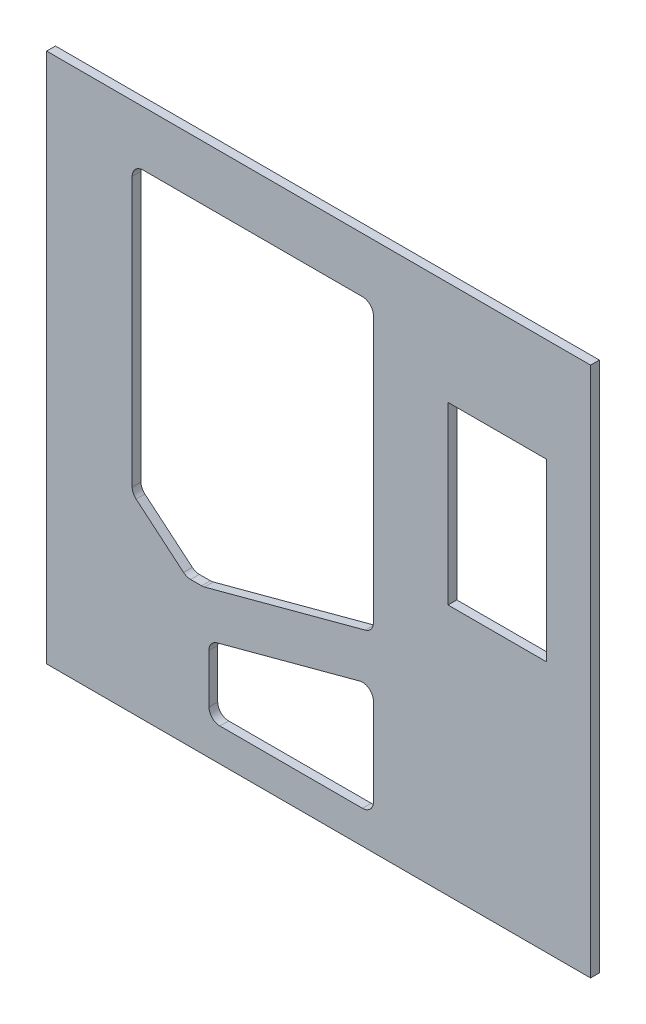
ISO-10303-21;
HEADER;
FILE_DESCRIPTION(('STEP AP214'),'2;1');
FILE_NAME('part.step','',(''),(''),'','','');
FILE_SCHEMA(('AUTOMOTIVE_DESIGN { 1 0 10303 214 1 1 1 1 }'));
ENDSEC;
DATA;
#1=APPLICATION_CONTEXT('core data for automotive mechanical design processes');
#2=APPLICATION_PROTOCOL_DEFINITION('international standard','automotive_design',2000,#1);
#3=PRODUCT_CONTEXT('',#1,'mechanical');
#4=PRODUCT('Part','Part','',(#3));
#5=PRODUCT_RELATED_PRODUCT_CATEGORY('part','',(#4));
#6=PRODUCT_DEFINITION_FORMATION('','',#4);
#7=PRODUCT_DEFINITION_CONTEXT('part definition',#1,'design');
#8=PRODUCT_DEFINITION('design','',#6,#7);
#9=PRODUCT_DEFINITION_SHAPE('','',#8);
#10=(LENGTH_UNIT() NAMED_UNIT(*) SI_UNIT(.MILLI.,.METRE.));
#11=(NAMED_UNIT(*) PLANE_ANGLE_UNIT() SI_UNIT($,.RADIAN.));
#12=(NAMED_UNIT(*) SI_UNIT($,.STERADIAN.) SOLID_ANGLE_UNIT());
#13=UNCERTAINTY_MEASURE_WITH_UNIT(LENGTH_MEASURE(1.E-05),#10,'distance_accuracy_value','');
#14=(GEOMETRIC_REPRESENTATION_CONTEXT(3) GLOBAL_UNCERTAINTY_ASSIGNED_CONTEXT((#13)) GLOBAL_UNIT_ASSIGNED_CONTEXT((#10,
#11,#12)) REPRESENTATION_CONTEXT('',''));
#15=CARTESIAN_POINT('',(0.,0.,0.));
#16=DIRECTION('',(0.,0.,1.));
#17=DIRECTION('',(1.,0.,0.));
#18=AXIS2_PLACEMENT_3D('',#15,#16,#17);
#19=CARTESIAN_POINT('',(0.,0.,8.));
#20=DIRECTION('',(0.,0.,-1.));
#21=DIRECTION('',(-1.,0.,0.));
#22=AXIS2_PLACEMENT_3D('',#19,#20,#21);
#23=PLANE('',#22);
#24=DIRECTION('',(0.,-1.,0.));
#25=VECTOR('',#24,1.);
#26=CARTESIAN_POINT('',(118.,147.567761437242,8.));
#27=LINE('',#26,#25);
#28=CARTESIAN_POINT('',(118.,147.567761437242,8.));
#29=VERTEX_POINT('',#28);
#30=CARTESIAN_POINT('',(118.,-12.4322385627576,8.));
#31=VERTEX_POINT('',#30);
#32=EDGE_CURVE('E246',#29,#31,#27,.T.);
#33=ORIENTED_EDGE('',*,*,#32,.F.);
#34=DIRECTION('',(-1.,0.,0.));
#35=VECTOR('',#34,1.);
#36=CARTESIAN_POINT('',(208.,147.567761437242,8.));
#37=LINE('',#36,#35);
#38=CARTESIAN_POINT('',(208.,147.567761437242,8.));
#39=VERTEX_POINT('',#38);
#40=EDGE_CURVE('E52',#39,#29,#37,.T.);
#41=ORIENTED_EDGE('',*,*,#40,.F.);
#42=DIRECTION('',(0.,1.,0.));
#43=VECTOR('',#42,1.);
#44=CARTESIAN_POINT('',(208.,-12.4322385627576,8.));
#45=LINE('',#44,#43);
#46=CARTESIAN_POINT('',(208.,-12.4322385627576,8.));
#47=VERTEX_POINT('',#46);
#48=EDGE_CURVE('E235',#47,#39,#45,.T.);
#49=ORIENTED_EDGE('',*,*,#48,.F.);
#50=DIRECTION('',(1.,0.,0.));
#51=VECTOR('',#50,1.);
#52=CARTESIAN_POINT('',(118.,-12.4322385627576,8.));
#53=LINE('',#52,#51);
#54=EDGE_CURVE('E255',#31,#47,#53,.T.);
#55=ORIENTED_EDGE('',*,*,#54,.F.);
#56=EDGE_LOOP('',(#33,#41,#49,#55));
#57=FACE_BOUND('',#56,.T.);
#58=DIRECTION('',(0.,1.,0.));
#59=VECTOR('',#58,1.);
#60=CARTESIAN_POINT('',(50.,-109.411047216403,8.));
#61=LINE('',#60,#59);
#62=CARTESIAN_POINT('',(50.,-202.,8.));
#63=VERTEX_POINT('',#62);
#64=CARTESIAN_POINT('',(50.,-122.443300944815,8.));
#65=VERTEX_POINT('',#64);
#66=EDGE_CURVE('E290',#63,#65,#61,.T.);
#67=ORIENTED_EDGE('',*,*,#66,.F.);
#68=CARTESIAN_POINT('',(40.,-202.,8.));
#69=DIRECTION('',(0.,0.,-1.));
#70=DIRECTION('',(-1.,0.,0.));
#71=AXIS2_PLACEMENT_3D('',#68,#69,#70);
#72=CIRCLE('',#71,10.);
#73=CARTESIAN_POINT('',(40.,-212.,8.));
#74=VERTEX_POINT('',#73);
#75=EDGE_CURVE('E434',#63,#74,#72,.T.);
#76=ORIENTED_EDGE('',*,*,#75,.T.);
#77=DIRECTION('',(1.,0.,0.));
#78=VECTOR('',#77,1.);
#79=CARTESIAN_POINT('',(-100.,-212.,8.));
#80=LINE('',#79,#78);
#81=CARTESIAN_POINT('',(-90.,-212.,8.));
#82=VERTEX_POINT('',#81);
#83=EDGE_CURVE('E228',#82,#74,#80,.T.);
#84=ORIENTED_EDGE('',*,*,#83,.F.);
#85=CARTESIAN_POINT('',(-90.,-202.,8.));
#86=DIRECTION('',(0.,0.,-1.));
#87=DIRECTION('',(-1.,0.,0.));
#88=AXIS2_PLACEMENT_3D('',#85,#86,#87);
#89=CIRCLE('',#88,10.);
#90=CARTESIAN_POINT('',(-100.,-202.,8.));
#91=VERTEX_POINT('',#90);
#92=EDGE_CURVE('E416',#82,#91,#89,.T.);
#93=ORIENTED_EDGE('',*,*,#92,.T.);
#94=DIRECTION('',(0.,-1.,0.));
#95=VECTOR('',#94,1.);
#96=CARTESIAN_POINT('',(-100.,-149.603426081072,8.));
#97=LINE('',#96,#95);
#98=CARTESIAN_POINT('',(-100.,-157.276695960862,8.));
#99=VERTEX_POINT('',#98);
#100=EDGE_CURVE('E274',#99,#91,#97,.T.);
#101=ORIENTED_EDGE('',*,*,#100,.F.);
#102=CARTESIAN_POINT('',(-90.,-157.276695960862,8.));
#103=DIRECTION('',(0.,0.,-1.));
#104=DIRECTION('',(-1.,0.,0.));
#105=AXIS2_PLACEMENT_3D('',#102,#103,#104);
#106=CIRCLE('',#105,10.);
#107=CARTESIAN_POINT('',(-92.5881904510253,-147.617437697971,8.));
#108=VERTEX_POINT('',#107);
#109=EDGE_CURVE('E422',#99,#108,#106,.T.);
#110=ORIENTED_EDGE('',*,*,#109,.T.);
#111=DIRECTION('',(-0.965925826289068,-0.258819045102522,0.));
#112=VECTOR('',#111,1.);
#113=CARTESIAN_POINT('',(50.,-109.411047216403,8.));
#114=LINE('',#113,#112);
#115=CARTESIAN_POINT('',(37.4118095489747,-112.784042681925,8.));
#116=VERTEX_POINT('',#115);
#117=EDGE_CURVE('E294',#116,#108,#114,.T.);
#118=ORIENTED_EDGE('',*,*,#117,.F.);
#119=CARTESIAN_POINT('',(40.,-122.443300944815,8.));
#120=DIRECTION('',(0.,0.,-1.));
#121=DIRECTION('',(-1.,0.,0.));
#122=AXIS2_PLACEMENT_3D('',#119,#120,#121);
#123=CIRCLE('',#122,10.);
#124=EDGE_CURVE('E428',#116,#65,#123,.T.);
#125=ORIENTED_EDGE('',*,*,#124,.T.);
#126=EDGE_LOOP('',(#67,#76,#84,#93,#101,#110,#118,#125));
#127=FACE_BOUND('',#126,.T.);
#128=DIRECTION('',(0.,1.,0.));
#129=VECTOR('',#128,1.);
#130=CARTESIAN_POINT('',(248.,-242.,8.));
#131=LINE('',#130,#129);
#132=CARTESIAN_POINT('',(248.,-242.,8.));
#133=VERTEX_POINT('',#132);
#134=CARTESIAN_POINT('',(248.,242.,8.));
#135=VERTEX_POINT('',#134);
#136=EDGE_CURVE('E347',#133,#135,#131,.T.);
#137=ORIENTED_EDGE('',*,*,#136,.T.);
#138=DIRECTION('',(-1.,0.,0.));
#139=VECTOR('',#138,1.);
#140=CARTESIAN_POINT('',(-248.,242.,8.));
#141=LINE('',#140,#139);
#142=CARTESIAN_POINT('',(-248.,242.,8.));
#143=VERTEX_POINT('',#142);
#144=EDGE_CURVE('E351',#135,#143,#141,.T.);
#145=ORIENTED_EDGE('',*,*,#144,.T.);
#146=DIRECTION('',(0.,-1.,0.));
#147=VECTOR('',#146,1.);
#148=CARTESIAN_POINT('',(-248.,-242.,8.));
#149=LINE('',#148,#147);
#150=CARTESIAN_POINT('',(-248.,-242.,8.));
#151=VERTEX_POINT('',#150);
#152=EDGE_CURVE('E355',#143,#151,#149,.T.);
#153=ORIENTED_EDGE('',*,*,#152,.T.);
#154=DIRECTION('',(1.,0.,0.));
#155=VECTOR('',#154,1.);
#156=CARTESIAN_POINT('',(-248.,-242.,8.));
#157=LINE('',#156,#155);
#158=EDGE_CURVE('E358',#151,#133,#157,.T.);
#159=ORIENTED_EDGE('',*,*,#158,.T.);
#160=EDGE_LOOP('',(#137,#145,#153,#159));
#161=FACE_BOUND('',#160,.T.);
#162=DIRECTION('',(-0.766044443118977,0.642787609686541,0.));
#163=VECTOR('',#162,1.);
#164=CARTESIAN_POINT('',(-103.723368500726,-123.612697046713,8.));
#165=LINE('',#164,#163);
#166=CARTESIAN_POINT('',(-123.170141308861,-107.294917155819,8.));
#167=VERTEX_POINT('',#166);
#168=CARTESIAN_POINT('',(-166.427876096865,-70.9973678496399,8.));
#169=VERTEX_POINT('',#168);
#170=EDGE_CURVE('E329',#167,#169,#165,.T.);
#171=ORIENTED_EDGE('',*,*,#170,.T.);
#172=CARTESIAN_POINT('',(-160.,-63.3369234184501,8.));
#173=DIRECTION('',(0.,0.,-1.));
#174=DIRECTION('',(-1.,0.,0.));
#175=AXIS2_PLACEMENT_3D('',#172,#173,#174);
#176=CIRCLE('',#175,10.);
#177=CARTESIAN_POINT('',(-170.,-63.3369234184501,8.));
#178=VERTEX_POINT('',#177);
#179=EDGE_CURVE('E500',#169,#178,#176,.T.);
#180=ORIENTED_EDGE('',*,*,#179,.T.);
#181=DIRECTION('',(0.,1.,0.));
#182=VECTOR('',#181,1.);
#183=CARTESIAN_POINT('',(-170.,0.,8.));
#184=LINE('',#183,#182);
#185=CARTESIAN_POINT('',(-170.,182.,8.));
#186=VERTEX_POINT('',#185);
#187=EDGE_CURVE('E286',#178,#186,#184,.T.);
#188=ORIENTED_EDGE('',*,*,#187,.T.);
#189=CARTESIAN_POINT('',(-160.,182.,8.));
#190=DIRECTION('',(0.,0.,-1.));
#191=DIRECTION('',(-1.,0.,0.));
#192=AXIS2_PLACEMENT_3D('',#189,#190,#191);
#193=CIRCLE('',#192,10.);
#194=CARTESIAN_POINT('',(-160.,192.,8.));
#195=VERTEX_POINT('',#194);
#196=EDGE_CURVE('E482',#186,#195,#193,.T.);
#197=ORIENTED_EDGE('',*,*,#196,.T.);
#198=DIRECTION('',(-1.,0.,0.));
#199=VECTOR('',#198,1.);
#200=CARTESIAN_POINT('',(0.,192.,8.));
#201=LINE('',#200,#199);
#202=CARTESIAN_POINT('',(40.,192.,8.));
#203=VERTEX_POINT('',#202);
#204=EDGE_CURVE('E306',#203,#195,#201,.T.);
#205=ORIENTED_EDGE('',*,*,#204,.F.);
#206=CARTESIAN_POINT('',(40.,182.,8.));
#207=DIRECTION('',(0.,0.,-1.));
#208=DIRECTION('',(-1.,0.,0.));
#209=AXIS2_PLACEMENT_3D('',#206,#207,#208);
#210=CIRCLE('',#209,10.);
#211=CARTESIAN_POINT('',(50.,182.,8.));
#212=VERTEX_POINT('',#211);
#213=EDGE_CURVE('E506',#203,#212,#210,.T.);
#214=ORIENTED_EDGE('',*,*,#213,.T.);
#215=DIRECTION('',(0.,1.,0.));
#216=VECTOR('',#215,1.);
#217=CARTESIAN_POINT('',(50.,0.,8.));
#218=LINE('',#217,#216);
#219=CARTESIAN_POINT('',(50.,-60.3267301202105,8.));
#220=VERTEX_POINT('',#219);
#221=EDGE_CURVE('E341',#220,#212,#218,.T.);
#222=ORIENTED_EDGE('',*,*,#221,.F.);
#223=CARTESIAN_POINT('',(40.,-60.3267301202105,8.));
#224=DIRECTION('',(0.,0.,-1.));
#225=DIRECTION('',(-1.,0.,0.));
#226=AXIS2_PLACEMENT_3D('',#223,#224,#225);
#227=CIRCLE('',#226,10.);
#228=CARTESIAN_POINT('',(42.5881904510252,-69.9859883831012,8.));
#229=VERTEX_POINT('',#228);
#230=EDGE_CURVE('E45',#220,#229,#227,.T.);
#231=ORIENTED_EDGE('',*,*,#230,.T.);
#232=DIRECTION('',(-0.965925826289068,-0.258819045102522,0.));
#233=VECTOR('',#232,1.);
#234=CARTESIAN_POINT('',(20.3493649053891,-75.944863728671,8.));
#235=LINE('',#234,#233);
#236=CARTESIAN_POINT('',(-104.110302079506,-109.29373098752,8.));
#237=VERTEX_POINT('',#236);
#238=EDGE_CURVE('E337',#229,#237,#235,.T.);
#239=ORIENTED_EDGE('',*,*,#238,.T.);
#240=CARTESIAN_POINT('',(-106.698492530531,-99.6344727246296,8.));
#241=DIRECTION('',(0.,0.,-1.));
#242=DIRECTION('',(-1.,0.,0.));
#243=AXIS2_PLACEMENT_3D('',#240,#241,#242);
#244=CIRCLE('',#243,10.);
#245=CARTESIAN_POINT('',(-106.698492530531,-109.63447272463,8.));
#246=VERTEX_POINT('',#245);
#247=EDGE_CURVE('E488',#237,#246,#244,.T.);
#248=ORIENTED_EDGE('',*,*,#247,.T.);
#249=DIRECTION('',(-1.,0.,0.));
#250=VECTOR('',#249,1.);
#251=CARTESIAN_POINT('',(0.,-109.63447272463,8.));
#252=LINE('',#251,#250);
#253=CARTESIAN_POINT('',(-116.742265211995,-109.63447272463,8.));
#254=VERTEX_POINT('',#253);
#255=EDGE_CURVE('E333',#246,#254,#252,.T.);
#256=ORIENTED_EDGE('',*,*,#255,.T.);
#257=CARTESIAN_POINT('',(-116.742265211995,-99.6344727246296,8.));
#258=DIRECTION('',(0.,0.,-1.));
#259=DIRECTION('',(-1.,0.,0.));
#260=AXIS2_PLACEMENT_3D('',#257,#258,#259);
#261=CIRCLE('',#260,10.);
#262=EDGE_CURVE('E494',#254,#167,#261,.T.);
#263=ORIENTED_EDGE('',*,*,#262,.T.);
#264=EDGE_LOOP('',(#171,#180,#188,#197,#205,#214,#222,#231,#239,#248,#256,#263));
#265=FACE_BOUND('',#264,.T.);
#266=ADVANCED_FACE('F36',(#57,#127,#161,#265),#23,.F.);
#267=CARTESIAN_POINT('',(0.,0.,0.));
#268=DIRECTION('',(0.,0.,-1.));
#269=DIRECTION('',(-1.,0.,0.));
#270=AXIS2_PLACEMENT_3D('',#267,#268,#269);
#271=PLANE('',#270);
#272=DIRECTION('',(-1.,0.,0.));
#273=VECTOR('',#272,1.);
#274=CARTESIAN_POINT('',(208.,147.567761437242,0.));
#275=LINE('',#274,#273);
#276=CARTESIAN_POINT('',(208.,147.567761437242,0.));
#277=VERTEX_POINT('',#276);
#278=CARTESIAN_POINT('',(118.,147.567761437242,0.));
#279=VERTEX_POINT('',#278);
#280=EDGE_CURVE('E232',#277,#279,#275,.T.);
#281=ORIENTED_EDGE('',*,*,#280,.T.);
#282=DIRECTION('',(0.,-1.,0.));
#283=VECTOR('',#282,1.);
#284=CARTESIAN_POINT('',(118.,147.567761437242,0.));
#285=LINE('',#284,#283);
#286=CARTESIAN_POINT('',(118.,-12.4322385627576,0.));
#287=VERTEX_POINT('',#286);
#288=EDGE_CURVE('E220',#279,#287,#285,.T.);
#289=ORIENTED_EDGE('',*,*,#288,.T.);
#290=DIRECTION('',(1.,0.,0.));
#291=VECTOR('',#290,1.);
#292=CARTESIAN_POINT('',(118.,-12.4322385627576,0.));
#293=LINE('',#292,#291);
#294=CARTESIAN_POINT('',(208.,-12.4322385627576,0.));
#295=VERTEX_POINT('',#294);
#296=EDGE_CURVE('E249',#287,#295,#293,.T.);
#297=ORIENTED_EDGE('',*,*,#296,.T.);
#298=DIRECTION('',(0.,1.,0.));
#299=VECTOR('',#298,1.);
#300=CARTESIAN_POINT('',(208.,-12.4322385627576,0.));
#301=LINE('',#300,#299);
#302=EDGE_CURVE('E240',#295,#277,#301,.T.);
#303=ORIENTED_EDGE('',*,*,#302,.T.);
#304=EDGE_LOOP('',(#281,#289,#297,#303));
#305=FACE_BOUND('',#304,.T.);
#306=DIRECTION('',(0.,-1.,0.));
#307=VECTOR('',#306,1.);
#308=CARTESIAN_POINT('',(-100.,-149.603426081072,0.));
#309=LINE('',#308,#307);
#310=CARTESIAN_POINT('',(-100.,-157.276695960862,0.));
#311=VERTEX_POINT('',#310);
#312=CARTESIAN_POINT('',(-100.,-202.,0.));
#313=VERTEX_POINT('',#312);
#314=EDGE_CURVE('E282',#311,#313,#309,.T.);
#315=ORIENTED_EDGE('',*,*,#314,.T.);
#316=CARTESIAN_POINT('',(-90.,-202.,0.));
#317=DIRECTION('',(0.,0.,-1.));
#318=DIRECTION('',(-1.,0.,0.));
#319=AXIS2_PLACEMENT_3D('',#316,#317,#318);
#320=CIRCLE('',#319,10.);
#321=CARTESIAN_POINT('',(-90.,-212.,0.));
#322=VERTEX_POINT('',#321);
#323=EDGE_CURVE('E419',#313,#322,#320,.F.);
#324=ORIENTED_EDGE('',*,*,#323,.T.);
#325=DIRECTION('',(1.,0.,0.));
#326=VECTOR('',#325,1.);
#327=CARTESIAN_POINT('',(-100.,-212.,0.));
#328=LINE('',#327,#326);
#329=CARTESIAN_POINT('',(40.,-212.,0.));
#330=VERTEX_POINT('',#329);
#331=EDGE_CURVE('E269',#322,#330,#328,.T.);
#332=ORIENTED_EDGE('',*,*,#331,.T.);
#333=CARTESIAN_POINT('',(40.,-202.,0.));
#334=DIRECTION('',(0.,0.,-1.));
#335=DIRECTION('',(-1.,0.,0.));
#336=AXIS2_PLACEMENT_3D('',#333,#334,#335);
#337=CIRCLE('',#336,10.);
#338=CARTESIAN_POINT('',(50.,-202.,0.));
#339=VERTEX_POINT('',#338);
#340=EDGE_CURVE('E437',#330,#339,#337,.F.);
#341=ORIENTED_EDGE('',*,*,#340,.T.);
#342=DIRECTION('',(0.,1.,0.));
#343=VECTOR('',#342,1.);
#344=CARTESIAN_POINT('',(50.,-109.411047216403,0.));
#345=LINE('',#344,#343);
#346=CARTESIAN_POINT('',(50.,-122.443300944815,0.));
#347=VERTEX_POINT('',#346);
#348=EDGE_CURVE('E273',#339,#347,#345,.T.);
#349=ORIENTED_EDGE('',*,*,#348,.T.);
#350=CARTESIAN_POINT('',(40.,-122.443300944815,0.));
#351=DIRECTION('',(0.,0.,-1.));
#352=DIRECTION('',(-1.,0.,0.));
#353=AXIS2_PLACEMENT_3D('',#350,#351,#352);
#354=CIRCLE('',#353,10.);
#355=CARTESIAN_POINT('',(37.4118095489747,-112.784042681925,0.));
#356=VERTEX_POINT('',#355);
#357=EDGE_CURVE('E431',#347,#356,#354,.F.);
#358=ORIENTED_EDGE('',*,*,#357,.T.);
#359=DIRECTION('',(-0.965925826289068,-0.258819045102522,0.));
#360=VECTOR('',#359,1.);
#361=CARTESIAN_POINT('',(50.,-109.411047216403,0.));
#362=LINE('',#361,#360);
#363=CARTESIAN_POINT('',(-92.5881904510253,-147.617437697971,0.));
#364=VERTEX_POINT('',#363);
#365=EDGE_CURVE('E278',#356,#364,#362,.T.);
#366=ORIENTED_EDGE('',*,*,#365,.T.);
#367=CARTESIAN_POINT('',(-90.,-157.276695960862,0.));
#368=DIRECTION('',(0.,0.,-1.));
#369=DIRECTION('',(-1.,0.,0.));
#370=AXIS2_PLACEMENT_3D('',#367,#368,#369);
#371=CIRCLE('',#370,10.);
#372=EDGE_CURVE('E425',#364,#311,#371,.F.);
#373=ORIENTED_EDGE('',*,*,#372,.T.);
#374=EDGE_LOOP('',(#315,#324,#332,#341,#349,#358,#366,#373));
#375=FACE_BOUND('',#374,.T.);
#376=DIRECTION('',(0.,1.,0.));
#377=VECTOR('',#376,1.);
#378=CARTESIAN_POINT('',(248.,-242.,0.));
#379=LINE('',#378,#377);
#380=CARTESIAN_POINT('',(248.,-242.,0.));
#381=VERTEX_POINT('',#380);
#382=CARTESIAN_POINT('',(248.,242.,0.));
#383=VERTEX_POINT('',#382);
#384=EDGE_CURVE('E325',#381,#383,#379,.T.);
#385=ORIENTED_EDGE('',*,*,#384,.F.);
#386=DIRECTION('',(1.,0.,0.));
#387=VECTOR('',#386,1.);
#388=CARTESIAN_POINT('',(-248.,-242.,0.));
#389=LINE('',#388,#387);
#390=CARTESIAN_POINT('',(-248.,-242.,0.));
#391=VERTEX_POINT('',#390);
#392=EDGE_CURVE('E352',#391,#381,#389,.T.);
#393=ORIENTED_EDGE('',*,*,#392,.F.);
#394=DIRECTION('',(0.,-1.,0.));
#395=VECTOR('',#394,1.);
#396=CARTESIAN_POINT('',(-248.,-242.,0.));
#397=LINE('',#396,#395);
#398=CARTESIAN_POINT('',(-248.,242.,0.));
#399=VERTEX_POINT('',#398);
#400=EDGE_CURVE('E368',#399,#391,#397,.T.);
#401=ORIENTED_EDGE('',*,*,#400,.F.);
#402=DIRECTION('',(-1.,0.,0.));
#403=VECTOR('',#402,1.);
#404=CARTESIAN_POINT('',(-248.,242.,0.));
#405=LINE('',#404,#403);
#406=EDGE_CURVE('E365',#383,#399,#405,.T.);
#407=ORIENTED_EDGE('',*,*,#406,.F.);
#408=EDGE_LOOP('',(#385,#393,#401,#407));
#409=FACE_BOUND('',#408,.T.);
#410=DIRECTION('',(0.,1.,0.));
#411=VECTOR('',#410,1.);
#412=CARTESIAN_POINT('',(50.,0.,0.));
#413=LINE('',#412,#411);
#414=CARTESIAN_POINT('',(50.,-60.3267301202105,0.));
#415=VERTEX_POINT('',#414);
#416=CARTESIAN_POINT('',(50.,182.,0.));
#417=VERTEX_POINT('',#416);
#418=EDGE_CURVE('E317',#415,#417,#413,.T.);
#419=ORIENTED_EDGE('',*,*,#418,.T.);
#420=CARTESIAN_POINT('',(40.,182.,0.));
#421=DIRECTION('',(0.,0.,-1.));
#422=DIRECTION('',(-1.,0.,0.));
#423=AXIS2_PLACEMENT_3D('',#420,#421,#422);
#424=CIRCLE('',#423,10.);
#425=CARTESIAN_POINT('',(40.,192.,0.));
#426=VERTEX_POINT('',#425);
#427=EDGE_CURVE('E509',#417,#426,#424,.F.);
#428=ORIENTED_EDGE('',*,*,#427,.T.);
#429=DIRECTION('',(-1.,0.,0.));
#430=VECTOR('',#429,1.);
#431=CARTESIAN_POINT('',(0.,192.,0.));
#432=LINE('',#431,#430);
#433=CARTESIAN_POINT('',(-160.,192.,0.));
#434=VERTEX_POINT('',#433);
#435=EDGE_CURVE('E321',#426,#434,#432,.T.);
#436=ORIENTED_EDGE('',*,*,#435,.T.);
#437=CARTESIAN_POINT('',(-160.,182.,0.));
#438=DIRECTION('',(0.,0.,-1.));
#439=DIRECTION('',(-1.,0.,0.));
#440=AXIS2_PLACEMENT_3D('',#437,#438,#439);
#441=CIRCLE('',#440,10.);
#442=CARTESIAN_POINT('',(-170.,182.,0.));
#443=VERTEX_POINT('',#442);
#444=EDGE_CURVE('E485',#434,#443,#441,.F.);
#445=ORIENTED_EDGE('',*,*,#444,.T.);
#446=DIRECTION('',(0.,1.,0.));
#447=VECTOR('',#446,1.);
#448=CARTESIAN_POINT('',(-170.,0.,0.));
#449=LINE('',#448,#447);
#450=CARTESIAN_POINT('',(-170.,-63.3369234184501,0.));
#451=VERTEX_POINT('',#450);
#452=EDGE_CURVE('E301',#451,#443,#449,.T.);
#453=ORIENTED_EDGE('',*,*,#452,.F.);
#454=CARTESIAN_POINT('',(-160.,-63.3369234184501,0.));
#455=DIRECTION('',(0.,0.,-1.));
#456=DIRECTION('',(-1.,0.,0.));
#457=AXIS2_PLACEMENT_3D('',#454,#455,#456);
#458=CIRCLE('',#457,10.);
#459=CARTESIAN_POINT('',(-166.427876096865,-70.9973678496399,0.));
#460=VERTEX_POINT('',#459);
#461=EDGE_CURVE('E503',#451,#460,#458,.F.);
#462=ORIENTED_EDGE('',*,*,#461,.T.);
#463=DIRECTION('',(-0.766044443118977,0.642787609686541,0.));
#464=VECTOR('',#463,1.);
#465=CARTESIAN_POINT('',(-103.723368500726,-123.612697046713,0.));
#466=LINE('',#465,#464);
#467=CARTESIAN_POINT('',(-123.170141308861,-107.294917155819,0.));
#468=VERTEX_POINT('',#467);
#469=EDGE_CURVE('E305',#468,#460,#466,.T.);
#470=ORIENTED_EDGE('',*,*,#469,.F.);
#471=CARTESIAN_POINT('',(-116.742265211995,-99.6344727246296,0.));
#472=DIRECTION('',(0.,0.,-1.));
#473=DIRECTION('',(-1.,0.,0.));
#474=AXIS2_PLACEMENT_3D('',#471,#472,#473);
#475=CIRCLE('',#474,10.);
#476=CARTESIAN_POINT('',(-116.742265211995,-109.63447272463,0.));
#477=VERTEX_POINT('',#476);
#478=EDGE_CURVE('E497',#468,#477,#475,.F.);
#479=ORIENTED_EDGE('',*,*,#478,.T.);
#480=DIRECTION('',(-1.,0.,0.));
#481=VECTOR('',#480,1.);
#482=CARTESIAN_POINT('',(0.,-109.63447272463,0.));
#483=LINE('',#482,#481);
#484=CARTESIAN_POINT('',(-106.698492530531,-109.63447272463,0.));
#485=VERTEX_POINT('',#484);
#486=EDGE_CURVE('E309',#485,#477,#483,.T.);
#487=ORIENTED_EDGE('',*,*,#486,.F.);
#488=CARTESIAN_POINT('',(-106.698492530531,-99.6344727246296,0.));
#489=DIRECTION('',(0.,0.,-1.));
#490=DIRECTION('',(-1.,0.,0.));
#491=AXIS2_PLACEMENT_3D('',#488,#489,#490);
#492=CIRCLE('',#491,10.);
#493=CARTESIAN_POINT('',(-104.110302079506,-109.29373098752,0.));
#494=VERTEX_POINT('',#493);
#495=EDGE_CURVE('E491',#485,#494,#492,.F.);
#496=ORIENTED_EDGE('',*,*,#495,.T.);
#497=DIRECTION('',(-0.965925826289068,-0.258819045102522,0.));
#498=VECTOR('',#497,1.);
#499=CARTESIAN_POINT('',(20.3493649053891,-75.944863728671,0.));
#500=LINE('',#499,#498);
#501=CARTESIAN_POINT('',(42.5881904510252,-69.9859883831012,0.));
#502=VERTEX_POINT('',#501);
#503=EDGE_CURVE('E313',#502,#494,#500,.T.);
#504=ORIENTED_EDGE('',*,*,#503,.F.);
#505=CARTESIAN_POINT('',(40.,-60.3267301202105,0.));
#506=DIRECTION('',(0.,0.,-1.));
#507=DIRECTION('',(-1.,0.,0.));
#508=AXIS2_PLACEMENT_3D('',#505,#506,#507);
#509=CIRCLE('',#508,10.);
#510=EDGE_CURVE('E11',#502,#415,#509,.F.);
#511=ORIENTED_EDGE('',*,*,#510,.T.);
#512=EDGE_LOOP('',(#419,#428,#436,#445,#453,#462,#470,#479,#487,#496,#504,#511));
#513=FACE_BOUND('',#512,.T.);
#514=ADVANCED_FACE('F238',(#305,#375,#409,#513),#271,.T.);
#515=CARTESIAN_POINT('',(248.,-242.,8.));
#516=DIRECTION('',(-1.,0.,0.));
#517=DIRECTION('',(0.,0.,1.));
#518=AXIS2_PLACEMENT_3D('',#515,#516,#517);
#519=PLANE('',#518);
#520=ORIENTED_EDGE('',*,*,#384,.T.);
#521=DIRECTION('',(0.,0.,-1.));
#522=VECTOR('',#521,1.);
#523=CARTESIAN_POINT('',(248.,242.,8.));
#524=LINE('',#523,#522);
#525=EDGE_CURVE('E384',#135,#383,#524,.T.);
#526=ORIENTED_EDGE('',*,*,#525,.F.);
#527=ORIENTED_EDGE('',*,*,#136,.F.);
#528=DIRECTION('',(0.,0.,-1.));
#529=VECTOR('',#528,1.);
#530=CARTESIAN_POINT('',(248.,-242.,8.));
#531=LINE('',#530,#529);
#532=EDGE_CURVE('E361',#133,#381,#531,.T.);
#533=ORIENTED_EDGE('',*,*,#532,.T.);
#534=EDGE_LOOP('',(#520,#526,#527,#533));
#535=FACE_BOUND('',#534,.T.);
#536=ADVANCED_FACE('F582',(#535),#519,.F.);
#537=CARTESIAN_POINT('',(-248.,242.,8.));
#538=DIRECTION('',(0.,-1.,0.));
#539=DIRECTION('',(0.,0.,-1.));
#540=AXIS2_PLACEMENT_3D('',#537,#538,#539);
#541=PLANE('',#540);
#542=ORIENTED_EDGE('',*,*,#406,.T.);
#543=DIRECTION('',(0.,0.,-1.));
#544=VECTOR('',#543,1.);
#545=CARTESIAN_POINT('',(-248.,242.,8.));
#546=LINE('',#545,#544);
#547=EDGE_CURVE('E380',#143,#399,#546,.T.);
#548=ORIENTED_EDGE('',*,*,#547,.F.);
#549=ORIENTED_EDGE('',*,*,#144,.F.);
#550=ORIENTED_EDGE('',*,*,#525,.T.);
#551=EDGE_LOOP('',(#542,#548,#549,#550));
#552=FACE_BOUND('',#551,.T.);
#553=ADVANCED_FACE('F595',(#552),#541,.F.);
#554=CARTESIAN_POINT('',(-248.,-242.,8.));
#555=DIRECTION('',(1.,0.,0.));
#556=DIRECTION('',(0.,0.,-1.));
#557=AXIS2_PLACEMENT_3D('',#554,#555,#556);
#558=PLANE('',#557);
#559=ORIENTED_EDGE('',*,*,#400,.T.);
#560=DIRECTION('',(0.,0.,-1.));
#561=VECTOR('',#560,1.);
#562=CARTESIAN_POINT('',(-248.,-242.,8.));
#563=LINE('',#562,#561);
#564=EDGE_CURVE('E376',#151,#391,#563,.T.);
#565=ORIENTED_EDGE('',*,*,#564,.F.);
#566=ORIENTED_EDGE('',*,*,#152,.F.);
#567=ORIENTED_EDGE('',*,*,#547,.T.);
#568=EDGE_LOOP('',(#559,#565,#566,#567));
#569=FACE_BOUND('',#568,.T.);
#570=ADVANCED_FACE('F591',(#569),#558,.F.);
#571=CARTESIAN_POINT('',(-248.,-242.,8.));
#572=DIRECTION('',(0.,1.,0.));
#573=DIRECTION('',(0.,0.,1.));
#574=AXIS2_PLACEMENT_3D('',#571,#572,#573);
#575=PLANE('',#574);
#576=ORIENTED_EDGE('',*,*,#392,.T.);
#577=ORIENTED_EDGE('',*,*,#532,.F.);
#578=ORIENTED_EDGE('',*,*,#158,.F.);
#579=ORIENTED_EDGE('',*,*,#564,.T.);
#580=EDGE_LOOP('',(#576,#577,#578,#579));
#581=FACE_BOUND('',#580,.T.);
#582=ADVANCED_FACE('F588',(#581),#575,.F.);
#583=CARTESIAN_POINT('',(-170.,0.,0.));
#584=DIRECTION('',(1.,0.,0.));
#585=DIRECTION('',(0.,0.,-1.));
#586=AXIS2_PLACEMENT_3D('',#583,#584,#585);
#587=PLANE('',#586);
#588=ORIENTED_EDGE('',*,*,#452,.T.);
#589=DIRECTION('',(0.,0.,1.));
#590=VECTOR('',#589,1.);
#591=CARTESIAN_POINT('',(-170.,182.,0.));
#592=LINE('',#591,#590);
#593=EDGE_CURVE('E443',#443,#186,#592,.T.);
#594=ORIENTED_EDGE('',*,*,#593,.T.);
#595=ORIENTED_EDGE('',*,*,#187,.F.);
#596=DIRECTION('',(0.,0.,1.));
#597=VECTOR('',#596,1.);
#598=CARTESIAN_POINT('',(-170.,-63.3369234184501,0.));
#599=LINE('',#598,#597);
#600=EDGE_CURVE('E440',#178,#451,#599,.F.);
#601=ORIENTED_EDGE('',*,*,#600,.T.);
#602=EDGE_LOOP('',(#588,#594,#595,#601));
#603=FACE_BOUND('',#602,.T.);
#604=ADVANCED_FACE('F544',(#603),#587,.T.);
#605=CARTESIAN_POINT('',(0.,192.,0.));
#606=DIRECTION('',(0.,1.,0.));
#607=DIRECTION('',(0.,0.,1.));
#608=AXIS2_PLACEMENT_3D('',#605,#606,#607);
#609=PLANE('',#608);
#610=ORIENTED_EDGE('',*,*,#204,.T.);
#611=DIRECTION('',(0.,0.,1.));
#612=VECTOR('',#611,1.);
#613=CARTESIAN_POINT('',(-160.,192.,0.));
#614=LINE('',#613,#612);
#615=EDGE_CURVE('E451',#195,#434,#614,.F.);
#616=ORIENTED_EDGE('',*,*,#615,.T.);
#617=ORIENTED_EDGE('',*,*,#435,.F.);
#618=DIRECTION('',(0.,0.,1.));
#619=VECTOR('',#618,1.);
#620=CARTESIAN_POINT('',(40.,192.,8.));
#621=LINE('',#620,#619);
#622=EDGE_CURVE('E447',#426,#203,#621,.T.);
#623=ORIENTED_EDGE('',*,*,#622,.T.);
#624=EDGE_LOOP('',(#610,#616,#617,#623));
#625=FACE_BOUND('',#624,.T.);
#626=ADVANCED_FACE('F535',(#625),#609,.F.);
#627=CARTESIAN_POINT('',(50.,0.,0.));
#628=DIRECTION('',(1.,0.,0.));
#629=DIRECTION('',(0.,0.,-1.));
#630=AXIS2_PLACEMENT_3D('',#627,#628,#629);
#631=PLANE('',#630);
#632=ORIENTED_EDGE('',*,*,#221,.T.);
#633=DIRECTION('',(0.,0.,1.));
#634=VECTOR('',#633,1.);
#635=CARTESIAN_POINT('',(50.,182.,0.));
#636=LINE('',#635,#634);
#637=EDGE_CURVE('E479',#212,#417,#636,.F.);
#638=ORIENTED_EDGE('',*,*,#637,.T.);
#639=ORIENTED_EDGE('',*,*,#418,.F.);
#640=DIRECTION('',(0.,0.,1.));
#641=VECTOR('',#640,1.);
#642=CARTESIAN_POINT('',(50.,-60.3267301202105,0.));
#643=LINE('',#642,#641);
#644=EDGE_CURVE('E475',#415,#220,#643,.T.);
#645=ORIENTED_EDGE('',*,*,#644,.T.);
#646=EDGE_LOOP('',(#632,#638,#639,#645));
#647=FACE_BOUND('',#646,.T.);
#648=ADVANCED_FACE('F527',(#647),#631,.F.);
#649=CARTESIAN_POINT('',(20.3493649053891,-75.944863728671,0.));
#650=DIRECTION('',(-0.258819045102522,0.965925826289068,0.));
#651=DIRECTION('',(-0.965925826289068,-0.258819045102522,0.));
#652=AXIS2_PLACEMENT_3D('',#649,#650,#651);
#653=PLANE('',#652);
#654=ORIENTED_EDGE('',*,*,#503,.T.);
#655=DIRECTION('',(0.,0.,1.));
#656=VECTOR('',#655,1.);
#657=CARTESIAN_POINT('',(-104.110302079506,-109.29373098752,8.));
#658=LINE('',#657,#656);
#659=EDGE_CURVE('E457',#494,#237,#658,.T.);
#660=ORIENTED_EDGE('',*,*,#659,.T.);
#661=ORIENTED_EDGE('',*,*,#238,.F.);
#662=DIRECTION('',(0.,0.,1.));
#663=VECTOR('',#662,1.);
#664=CARTESIAN_POINT('',(42.5881904510252,-69.9859883831012,0.));
#665=LINE('',#664,#663);
#666=EDGE_CURVE('E454',#229,#502,#665,.F.);
#667=ORIENTED_EDGE('',*,*,#666,.T.);
#668=EDGE_LOOP('',(#654,#660,#661,#667));
#669=FACE_BOUND('',#668,.T.);
#670=ADVANCED_FACE('F519',(#669),#653,.T.);
#671=CARTESIAN_POINT('',(0.,-109.63447272463,0.));
#672=DIRECTION('',(0.,1.,0.));
#673=DIRECTION('',(0.,0.,1.));
#674=AXIS2_PLACEMENT_3D('',#671,#672,#673);
#675=PLANE('',#674);
#676=ORIENTED_EDGE('',*,*,#255,.F.);
#677=DIRECTION('',(0.,0.,1.));
#678=VECTOR('',#677,1.);
#679=CARTESIAN_POINT('',(-106.698492530531,-109.63447272463,0.));
#680=LINE('',#679,#678);
#681=EDGE_CURVE('E465',#246,#485,#680,.F.);
#682=ORIENTED_EDGE('',*,*,#681,.T.);
#683=ORIENTED_EDGE('',*,*,#486,.T.);
#684=DIRECTION('',(0.,0.,1.));
#685=VECTOR('',#684,1.);
#686=CARTESIAN_POINT('',(-116.742265211995,-109.63447272463,8.));
#687=LINE('',#686,#685);
#688=EDGE_CURVE('E461',#477,#254,#687,.T.);
#689=ORIENTED_EDGE('',*,*,#688,.T.);
#690=EDGE_LOOP('',(#676,#682,#683,#689));
#691=FACE_BOUND('',#690,.T.);
#692=ADVANCED_FACE('F563',(#691),#675,.T.);
#693=CARTESIAN_POINT('',(-103.723368500726,-123.612697046713,0.));
#694=DIRECTION('',(0.64278760968654,0.766044443118977,0.));
#695=DIRECTION('',(-0.766044443118977,0.64278760968654,0.));
#696=AXIS2_PLACEMENT_3D('',#693,#694,#695);
#697=PLANE('',#696);
#698=ORIENTED_EDGE('',*,*,#170,.F.);
#699=DIRECTION('',(0.,0.,1.));
#700=VECTOR('',#699,1.);
#701=CARTESIAN_POINT('',(-123.170141308861,-107.294917155819,0.));
#702=LINE('',#701,#700);
#703=EDGE_CURVE('E472',#167,#468,#702,.F.);
#704=ORIENTED_EDGE('',*,*,#703,.T.);
#705=ORIENTED_EDGE('',*,*,#469,.T.);
#706=DIRECTION('',(0.,0.,1.));
#707=VECTOR('',#706,1.);
#708=CARTESIAN_POINT('',(-166.427876096865,-70.9973678496399,8.));
#709=LINE('',#708,#707);
#710=EDGE_CURVE('E468',#460,#169,#709,.T.);
#711=ORIENTED_EDGE('',*,*,#710,.T.);
#712=EDGE_LOOP('',(#698,#704,#705,#711));
#713=FACE_BOUND('',#712,.T.);
#714=ADVANCED_FACE('F554',(#713),#697,.T.);
#715=CARTESIAN_POINT('',(-100.,-212.,0.));
#716=DIRECTION('',(0.,-1.,0.));
#717=DIRECTION('',(0.,0.,-1.));
#718=AXIS2_PLACEMENT_3D('',#715,#716,#717);
#719=PLANE('',#718);
#720=ORIENTED_EDGE('',*,*,#331,.F.);
#721=DIRECTION('',(0.,0.,1.));
#722=VECTOR('',#721,1.);
#723=CARTESIAN_POINT('',(-90.,-212.,8.));
#724=LINE('',#723,#722);
#725=EDGE_CURVE('E391',#322,#82,#724,.T.);
#726=ORIENTED_EDGE('',*,*,#725,.T.);
#727=ORIENTED_EDGE('',*,*,#83,.T.);
#728=DIRECTION('',(0.,0.,1.));
#729=VECTOR('',#728,1.);
#730=CARTESIAN_POINT('',(40.,-212.,0.));
#731=LINE('',#730,#729);
#732=EDGE_CURVE('E388',#74,#330,#731,.F.);
#733=ORIENTED_EDGE('',*,*,#732,.T.);
#734=EDGE_LOOP('',(#720,#726,#727,#733));
#735=FACE_BOUND('',#734,.T.);
#736=ADVANCED_FACE('F646',(#735),#719,.F.);
#737=CARTESIAN_POINT('',(-100.,-149.603426081072,0.));
#738=DIRECTION('',(-1.,0.,0.));
#739=DIRECTION('',(0.,-1.,0.));
#740=AXIS2_PLACEMENT_3D('',#737,#738,#739);
#741=PLANE('',#740);
#742=ORIENTED_EDGE('',*,*,#100,.T.);
#743=DIRECTION('',(0.,0.,1.));
#744=VECTOR('',#743,1.);
#745=CARTESIAN_POINT('',(-100.,-202.,0.));
#746=LINE('',#745,#744);
#747=EDGE_CURVE('E399',#91,#313,#746,.F.);
#748=ORIENTED_EDGE('',*,*,#747,.T.);
#749=ORIENTED_EDGE('',*,*,#314,.F.);
#750=DIRECTION('',(0.,0.,1.));
#751=VECTOR('',#750,1.);
#752=CARTESIAN_POINT('',(-100.,-157.276695960862,8.));
#753=LINE('',#752,#751);
#754=EDGE_CURVE('E395',#311,#99,#753,.T.);
#755=ORIENTED_EDGE('',*,*,#754,.T.);
#756=EDGE_LOOP('',(#742,#748,#749,#755));
#757=FACE_BOUND('',#756,.T.);
#758=ADVANCED_FACE('F641',(#757),#741,.F.);
#759=CARTESIAN_POINT('',(50.,-109.411047216403,0.));
#760=DIRECTION('',(-0.258819045102522,0.965925826289068,0.));
#761=DIRECTION('',(-0.965925826289068,-0.258819045102522,0.));
#762=AXIS2_PLACEMENT_3D('',#759,#760,#761);
#763=PLANE('',#762);
#764=ORIENTED_EDGE('',*,*,#117,.T.);
#765=DIRECTION('',(0.,0.,1.));
#766=VECTOR('',#765,1.);
#767=CARTESIAN_POINT('',(-92.5881904510252,-147.617437697971,0.));
#768=LINE('',#767,#766);
#769=EDGE_CURVE('E406',#108,#364,#768,.F.);
#770=ORIENTED_EDGE('',*,*,#769,.T.);
#771=ORIENTED_EDGE('',*,*,#365,.F.);
#772=DIRECTION('',(0.,0.,1.));
#773=VECTOR('',#772,1.);
#774=CARTESIAN_POINT('',(37.4118095489747,-112.784042681925,8.));
#775=LINE('',#774,#773);
#776=EDGE_CURVE('E402',#356,#116,#775,.T.);
#777=ORIENTED_EDGE('',*,*,#776,.T.);
#778=EDGE_LOOP('',(#764,#770,#771,#777));
#779=FACE_BOUND('',#778,.T.);
#780=ADVANCED_FACE('F634',(#779),#763,.F.);
#781=CARTESIAN_POINT('',(50.,-109.411047216403,0.));
#782=DIRECTION('',(1.,0.,0.));
#783=DIRECTION('',(0.,1.,0.));
#784=AXIS2_PLACEMENT_3D('',#781,#782,#783);
#785=PLANE('',#784);
#786=ORIENTED_EDGE('',*,*,#66,.T.);
#787=DIRECTION('',(0.,0.,1.));
#788=VECTOR('',#787,1.);
#789=CARTESIAN_POINT('',(50.,-122.443300944815,0.));
#790=LINE('',#789,#788);
#791=EDGE_CURVE('E413',#65,#347,#790,.F.);
#792=ORIENTED_EDGE('',*,*,#791,.T.);
#793=ORIENTED_EDGE('',*,*,#348,.F.);
#794=DIRECTION('',(0.,0.,1.));
#795=VECTOR('',#794,1.);
#796=CARTESIAN_POINT('',(50.,-202.,8.));
#797=LINE('',#796,#795);
#798=EDGE_CURVE('E409',#339,#63,#797,.T.);
#799=ORIENTED_EDGE('',*,*,#798,.T.);
#800=EDGE_LOOP('',(#786,#792,#793,#799));
#801=FACE_BOUND('',#800,.T.);
#802=ADVANCED_FACE('F607',(#801),#785,.F.);
#803=CARTESIAN_POINT('',(-90.,-202.,0.));
#804=DIRECTION('',(0.,0.,-1.));
#805=DIRECTION('',(-1.,0.,0.));
#806=AXIS2_PLACEMENT_3D('',#803,#804,#805);
#807=CYLINDRICAL_SURFACE('',#806,10.);
#808=ORIENTED_EDGE('',*,*,#323,.F.);
#809=ORIENTED_EDGE('',*,*,#747,.F.);
#810=ORIENTED_EDGE('',*,*,#92,.F.);
#811=ORIENTED_EDGE('',*,*,#725,.F.);
#812=EDGE_LOOP('',(#808,#809,#810,#811));
#813=FACE_BOUND('',#812,.T.);
#814=ADVANCED_FACE('F603',(#813),#807,.F.);
#815=CARTESIAN_POINT('',(-90.,-157.276695960862,0.));
#816=DIRECTION('',(0.,0.,-1.));
#817=DIRECTION('',(-1.,0.,0.));
#818=AXIS2_PLACEMENT_3D('',#815,#816,#817);
#819=CYLINDRICAL_SURFACE('',#818,10.);
#820=ORIENTED_EDGE('',*,*,#372,.F.);
#821=ORIENTED_EDGE('',*,*,#769,.F.);
#822=ORIENTED_EDGE('',*,*,#109,.F.);
#823=ORIENTED_EDGE('',*,*,#754,.F.);
#824=EDGE_LOOP('',(#820,#821,#822,#823));
#825=FACE_BOUND('',#824,.T.);
#826=ADVANCED_FACE('F606',(#825),#819,.F.);
#827=CARTESIAN_POINT('',(40.,-122.443300944815,0.));
#828=DIRECTION('',(0.,0.,-1.));
#829=DIRECTION('',(-1.,0.,0.));
#830=AXIS2_PLACEMENT_3D('',#827,#828,#829);
#831=CYLINDRICAL_SURFACE('',#830,10.);
#832=ORIENTED_EDGE('',*,*,#357,.F.);
#833=ORIENTED_EDGE('',*,*,#791,.F.);
#834=ORIENTED_EDGE('',*,*,#124,.F.);
#835=ORIENTED_EDGE('',*,*,#776,.F.);
#836=EDGE_LOOP('',(#832,#833,#834,#835));
#837=FACE_BOUND('',#836,.T.);
#838=ADVANCED_FACE('F611',(#837),#831,.F.);
#839=CARTESIAN_POINT('',(40.,-202.,0.));
#840=DIRECTION('',(0.,0.,-1.));
#841=DIRECTION('',(-1.,0.,0.));
#842=AXIS2_PLACEMENT_3D('',#839,#840,#841);
#843=CYLINDRICAL_SURFACE('',#842,10.);
#844=ORIENTED_EDGE('',*,*,#340,.F.);
#845=ORIENTED_EDGE('',*,*,#732,.F.);
#846=ORIENTED_EDGE('',*,*,#75,.F.);
#847=ORIENTED_EDGE('',*,*,#798,.F.);
#848=EDGE_LOOP('',(#844,#845,#846,#847));
#849=FACE_BOUND('',#848,.T.);
#850=ADVANCED_FACE('F574',(#849),#843,.F.);
#851=CARTESIAN_POINT('',(-160.,182.,0.));
#852=DIRECTION('',(0.,0.,1.));
#853=DIRECTION('',(1.,0.,0.));
#854=AXIS2_PLACEMENT_3D('',#851,#852,#853);
#855=CYLINDRICAL_SURFACE('',#854,10.);
#856=ORIENTED_EDGE('',*,*,#444,.F.);
#857=ORIENTED_EDGE('',*,*,#615,.F.);
#858=ORIENTED_EDGE('',*,*,#196,.F.);
#859=ORIENTED_EDGE('',*,*,#593,.F.);
#860=EDGE_LOOP('',(#856,#857,#858,#859));
#861=FACE_BOUND('',#860,.T.);
#862=ADVANCED_FACE('F539',(#861),#855,.F.);
#863=CARTESIAN_POINT('',(-106.698492530531,-99.6344727246296,0.));
#864=DIRECTION('',(0.,0.,-1.));
#865=DIRECTION('',(-1.,0.,0.));
#866=AXIS2_PLACEMENT_3D('',#863,#864,#865);
#867=CYLINDRICAL_SURFACE('',#866,10.);
#868=ORIENTED_EDGE('',*,*,#495,.F.);
#869=ORIENTED_EDGE('',*,*,#681,.F.);
#870=ORIENTED_EDGE('',*,*,#247,.F.);
#871=ORIENTED_EDGE('',*,*,#659,.F.);
#872=EDGE_LOOP('',(#868,#869,#870,#871));
#873=FACE_BOUND('',#872,.T.);
#874=ADVANCED_FACE('F566',(#873),#867,.F.);
#875=CARTESIAN_POINT('',(-116.742265211995,-99.6344727246296,0.));
#876=DIRECTION('',(0.,0.,-1.));
#877=DIRECTION('',(-1.,0.,0.));
#878=AXIS2_PLACEMENT_3D('',#875,#876,#877);
#879=CYLINDRICAL_SURFACE('',#878,10.);
#880=ORIENTED_EDGE('',*,*,#478,.F.);
#881=ORIENTED_EDGE('',*,*,#703,.F.);
#882=ORIENTED_EDGE('',*,*,#262,.F.);
#883=ORIENTED_EDGE('',*,*,#688,.F.);
#884=EDGE_LOOP('',(#880,#881,#882,#883));
#885=FACE_BOUND('',#884,.T.);
#886=ADVANCED_FACE('F557',(#885),#879,.F.);
#887=CARTESIAN_POINT('',(-160.,-63.3369234184501,0.));
#888=DIRECTION('',(0.,0.,-1.));
#889=DIRECTION('',(-1.,0.,0.));
#890=AXIS2_PLACEMENT_3D('',#887,#888,#889);
#891=CYLINDRICAL_SURFACE('',#890,10.);
#892=ORIENTED_EDGE('',*,*,#461,.F.);
#893=ORIENTED_EDGE('',*,*,#600,.F.);
#894=ORIENTED_EDGE('',*,*,#179,.F.);
#895=ORIENTED_EDGE('',*,*,#710,.F.);
#896=EDGE_LOOP('',(#892,#893,#894,#895));
#897=FACE_BOUND('',#896,.T.);
#898=ADVANCED_FACE('F548',(#897),#891,.F.);
#899=CARTESIAN_POINT('',(40.,182.,0.));
#900=DIRECTION('',(0.,0.,-1.));
#901=DIRECTION('',(-1.,0.,0.));
#902=AXIS2_PLACEMENT_3D('',#899,#900,#901);
#903=CYLINDRICAL_SURFACE('',#902,10.);
#904=ORIENTED_EDGE('',*,*,#427,.F.);
#905=ORIENTED_EDGE('',*,*,#637,.F.);
#906=ORIENTED_EDGE('',*,*,#213,.F.);
#907=ORIENTED_EDGE('',*,*,#622,.F.);
#908=EDGE_LOOP('',(#904,#905,#906,#907));
#909=FACE_BOUND('',#908,.T.);
#910=ADVANCED_FACE('F530',(#909),#903,.F.);
#911=CARTESIAN_POINT('',(40.,-60.3267301202105,0.));
#912=DIRECTION('',(0.,0.,1.));
#913=DIRECTION('',(1.,0.,0.));
#914=AXIS2_PLACEMENT_3D('',#911,#912,#913);
#915=CYLINDRICAL_SURFACE('',#914,10.);
#916=ORIENTED_EDGE('',*,*,#510,.F.);
#917=ORIENTED_EDGE('',*,*,#666,.F.);
#918=ORIENTED_EDGE('',*,*,#230,.F.);
#919=ORIENTED_EDGE('',*,*,#644,.F.);
#920=EDGE_LOOP('',(#916,#917,#918,#919));
#921=FACE_BOUND('',#920,.T.);
#922=ADVANCED_FACE('F38',(#921),#915,.F.);
#923=CARTESIAN_POINT('',(208.,147.567761437242,-0.000999999999999265));
#924=DIRECTION('',(0.,1.,0.));
#925=DIRECTION('',(0.,0.,1.));
#926=AXIS2_PLACEMENT_3D('',#923,#924,#925);
#927=PLANE('',#926);
#928=DIRECTION('',(0.,0.,1.));
#929=VECTOR('',#928,1.);
#930=CARTESIAN_POINT('',(208.,147.567761437242,-0.000999999999999265));
#931=LINE('',#930,#929);
#932=EDGE_CURVE('E229',#277,#39,#931,.T.);
#933=ORIENTED_EDGE('',*,*,#932,.T.);
#934=ORIENTED_EDGE('',*,*,#40,.T.);
#935=DIRECTION('',(0.,0.,1.));
#936=VECTOR('',#935,1.);
#937=CARTESIAN_POINT('',(118.,147.567761437242,-0.000999999999999265));
#938=LINE('',#937,#936);
#939=EDGE_CURVE('E222',#279,#29,#938,.T.);
#940=ORIENTED_EDGE('',*,*,#939,.F.);
#941=ORIENTED_EDGE('',*,*,#280,.F.);
#942=EDGE_LOOP('',(#933,#934,#940,#941));
#943=FACE_BOUND('',#942,.T.);
#944=ADVANCED_FACE('F231',(#943),#927,.F.);
#945=CARTESIAN_POINT('',(208.,-12.4322385627576,-0.000999999999999265));
#946=DIRECTION('',(1.,0.,0.));
#947=DIRECTION('',(0.,0.,-1.));
#948=AXIS2_PLACEMENT_3D('',#945,#946,#947);
#949=PLANE('',#948);
#950=DIRECTION('',(0.,0.,1.));
#951=VECTOR('',#950,1.);
#952=CARTESIAN_POINT('',(208.,-12.4322385627576,-0.000999999999999265));
#953=LINE('',#952,#951);
#954=EDGE_CURVE('E264',#295,#47,#953,.T.);
#955=ORIENTED_EDGE('',*,*,#954,.T.);
#956=ORIENTED_EDGE('',*,*,#48,.T.);
#957=ORIENTED_EDGE('',*,*,#932,.F.);
#958=ORIENTED_EDGE('',*,*,#302,.F.);
#959=EDGE_LOOP('',(#955,#956,#957,#958));
#960=FACE_BOUND('',#959,.T.);
#961=ADVANCED_FACE('F763',(#960),#949,.F.);
#962=CARTESIAN_POINT('',(118.,-12.4322385627576,-0.000999999999999265));
#963=DIRECTION('',(0.,-1.,0.));
#964=DIRECTION('',(0.,0.,-1.));
#965=AXIS2_PLACEMENT_3D('',#962,#963,#964);
#966=PLANE('',#965);
#967=DIRECTION('',(0.,0.,1.));
#968=VECTOR('',#967,1.);
#969=CARTESIAN_POINT('',(118.,-12.4322385627576,-0.000999999999999265));
#970=LINE('',#969,#968);
#971=EDGE_CURVE('E60',#287,#31,#970,.T.);
#972=ORIENTED_EDGE('',*,*,#971,.T.);
#973=ORIENTED_EDGE('',*,*,#54,.T.);
#974=ORIENTED_EDGE('',*,*,#954,.F.);
#975=ORIENTED_EDGE('',*,*,#296,.F.);
#976=EDGE_LOOP('',(#972,#973,#974,#975));
#977=FACE_BOUND('',#976,.T.);
#978=ADVANCED_FACE('F772',(#977),#966,.F.);
#979=CARTESIAN_POINT('',(118.,147.567761437242,-0.000999999999999265));
#980=DIRECTION('',(-1.,0.,0.));
#981=DIRECTION('',(0.,0.,1.));
#982=AXIS2_PLACEMENT_3D('',#979,#980,#981);
#983=PLANE('',#982);
#984=ORIENTED_EDGE('',*,*,#939,.T.);
#985=ORIENTED_EDGE('',*,*,#32,.T.);
#986=ORIENTED_EDGE('',*,*,#971,.F.);
#987=ORIENTED_EDGE('',*,*,#288,.F.);
#988=EDGE_LOOP('',(#984,#985,#986,#987));
#989=FACE_BOUND('',#988,.T.);
#990=ADVANCED_FACE('F221',(#989),#983,.F.);
#991=CLOSED_SHELL('',(#266,#514,#536,#553,#570,#582,#604,#626,#648,#670,#692,#714,#736,#758,
#780,#802,#814,#826,#838,#850,#862,#874,#886,#898,#910,#922,#944,#961,#978,#990));
#992=MANIFOLD_SOLID_BREP('B2',#991);
#993=ADVANCED_BREP_SHAPE_REPRESENTATION('',(#18,#992),#14);
#994=SHAPE_DEFINITION_REPRESENTATION(#9,#993);
ENDSEC;
END-ISO-10303-21;
